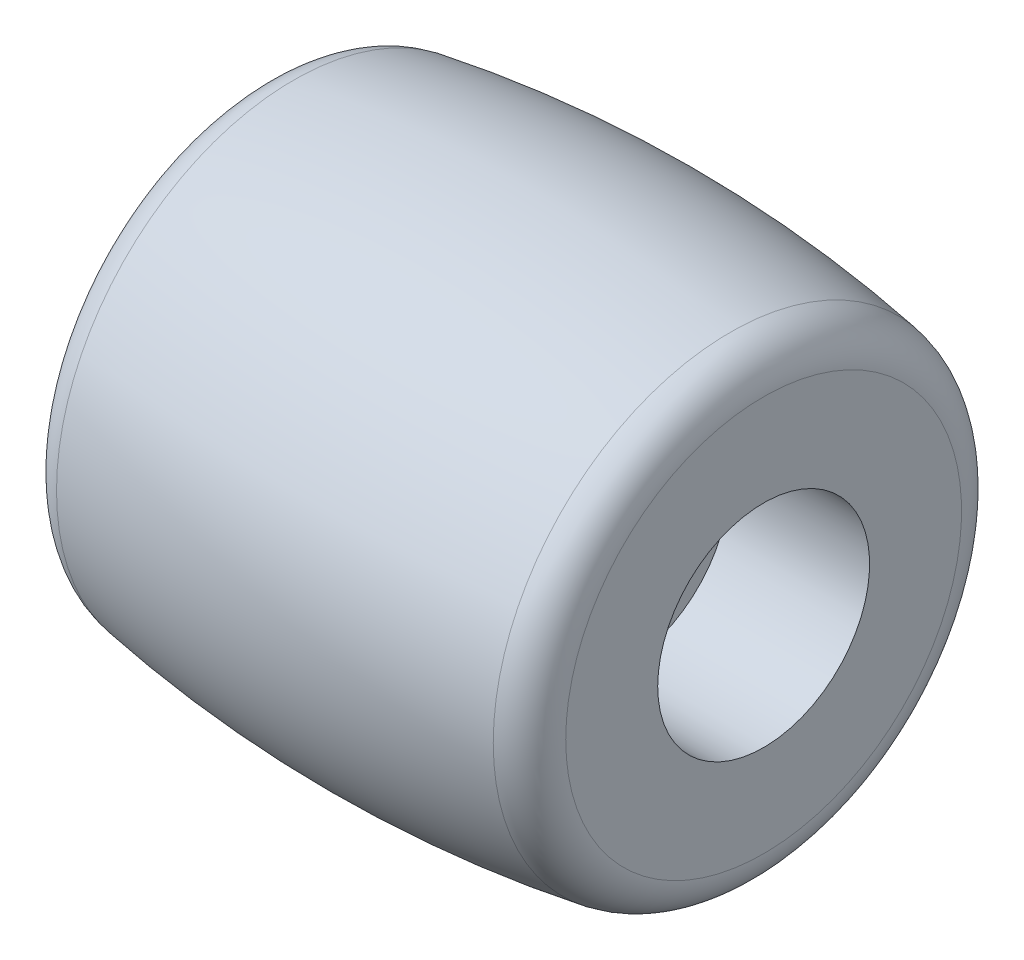
ISO-10303-21;
HEADER;
FILE_DESCRIPTION(('STEP AP214'),'2;1');
FILE_NAME('part.step','',(''),(''),'','','');
FILE_SCHEMA(('AUTOMOTIVE_DESIGN { 1 0 10303 214 1 1 1 1 }'));
ENDSEC;
DATA;
#1=APPLICATION_CONTEXT('core data for automotive mechanical design processes');
#2=APPLICATION_PROTOCOL_DEFINITION('international standard','automotive_design',2000,#1);
#3=PRODUCT_CONTEXT('',#1,'mechanical');
#4=PRODUCT('Part','Part','',(#3));
#5=PRODUCT_RELATED_PRODUCT_CATEGORY('part','',(#4));
#6=PRODUCT_DEFINITION_FORMATION('','',#4);
#7=PRODUCT_DEFINITION_CONTEXT('part definition',#1,'design');
#8=PRODUCT_DEFINITION('design','',#6,#7);
#9=PRODUCT_DEFINITION_SHAPE('','',#8);
#10=(LENGTH_UNIT() NAMED_UNIT(*) SI_UNIT(.MILLI.,.METRE.));
#11=(NAMED_UNIT(*) PLANE_ANGLE_UNIT() SI_UNIT($,.RADIAN.));
#12=(NAMED_UNIT(*) SI_UNIT($,.STERADIAN.) SOLID_ANGLE_UNIT());
#13=UNCERTAINTY_MEASURE_WITH_UNIT(LENGTH_MEASURE(1.E-05),#10,'distance_accuracy_value','');
#14=(GEOMETRIC_REPRESENTATION_CONTEXT(3) GLOBAL_UNCERTAINTY_ASSIGNED_CONTEXT((#13)) GLOBAL_UNIT_ASSIGNED_CONTEXT((#10,
#11,#12)) REPRESENTATION_CONTEXT('',''));
#15=CARTESIAN_POINT('',(0.,0.,0.));
#16=DIRECTION('',(0.,0.,1.));
#17=DIRECTION('',(1.,0.,0.));
#18=AXIS2_PLACEMENT_3D('',#15,#16,#17);
#19=CARTESIAN_POINT('',(-9.5,4.,0.));
#20=DIRECTION('',(1.,0.,0.));
#21=DIRECTION('',(0.,0.,-1.));
#22=AXIS2_PLACEMENT_3D('',#19,#20,#21);
#23=PLANE('',#22);
#24=CARTESIAN_POINT('',(-9.5,0.,0.));
#25=DIRECTION('',(1.,0.,0.));
#26=DIRECTION('',(0.,0.,-1.));
#27=AXIS2_PLACEMENT_3D('',#24,#25,#26);
#28=CIRCLE('',#27,7.47158261378696);
#29=CARTESIAN_POINT('',(-9.5,0.,-7.47158261378696));
#30=VERTEX_POINT('',#29);
#31=EDGE_CURVE('E10',#30,#30,#28,.F.);
#32=ORIENTED_EDGE('',*,*,#31,.T.);
#33=EDGE_LOOP('',(#32));
#34=FACE_BOUND('',#33,.T.);
#35=CARTESIAN_POINT('',(-9.5,0.,0.));
#36=DIRECTION('',(-1.,0.,0.));
#37=DIRECTION('',(0.,0.,1.));
#38=AXIS2_PLACEMENT_3D('',#35,#36,#37);
#39=CIRCLE('',#38,4.);
#40=CARTESIAN_POINT('',(-9.5,0.,4.));
#41=VERTEX_POINT('',#40);
#42=EDGE_CURVE('E65',#41,#41,#39,.T.);
#43=ORIENTED_EDGE('',*,*,#42,.F.);
#44=EDGE_LOOP('',(#43));
#45=FACE_BOUND('',#44,.T.);
#46=ADVANCED_FACE('F30',(#34,#45),#23,.F.);
#47=CARTESIAN_POINT('',(0.,0.,0.));
#48=DIRECTION('',(-1.,0.,0.));
#49=DIRECTION('',(0.,0.,1.));
#50=AXIS2_PLACEMENT_3D('',#47,#48,#49);
#51=DEGENERATE_TOROIDAL_SURFACE('',#50,41.175,50.8,.F.);
#52=CARTESIAN_POINT('',(8.24340770791075,0.,0.));
#53=DIRECTION('',(-1.,0.,0.));
#54=DIRECTION('',(0.,0.,1.));
#55=AXIS2_PLACEMENT_3D('',#52,#53,#54);
#56=CIRCLE('',#55,8.95170176025107);
#57=CARTESIAN_POINT('',(8.24340770791075,0.,8.95170176025107));
#58=VERTEX_POINT('',#57);
#59=EDGE_CURVE('E41',#58,#58,#56,.T.);
#60=ORIENTED_EDGE('',*,*,#59,.T.);
#61=EDGE_LOOP('',(#60));
#62=FACE_BOUND('',#61,.T.);
#63=CARTESIAN_POINT('',(-8.24340770791075,0.,0.));
#64=DIRECTION('',(1.,0.,0.));
#65=DIRECTION('',(0.,0.,-1.));
#66=AXIS2_PLACEMENT_3D('',#63,#64,#65);
#67=CIRCLE('',#66,8.95170176025107);
#68=CARTESIAN_POINT('',(-8.24340770791075,0.,-8.95170176025107));
#69=VERTEX_POINT('',#68);
#70=EDGE_CURVE('E45',#69,#69,#67,.T.);
#71=ORIENTED_EDGE('',*,*,#70,.T.);
#72=EDGE_LOOP('',(#71));
#73=FACE_BOUND('',#72,.T.);
#74=ADVANCED_FACE('F72',(#62,#73),#51,.F.);
#75=CARTESIAN_POINT('',(9.5,4.,0.));
#76=DIRECTION('',(-1.,0.,0.));
#77=DIRECTION('',(0.,0.,1.));
#78=AXIS2_PLACEMENT_3D('',#75,#76,#77);
#79=PLANE('',#78);
#80=CARTESIAN_POINT('',(9.5,0.,0.));
#81=DIRECTION('',(-1.,0.,0.));
#82=DIRECTION('',(0.,0.,1.));
#83=AXIS2_PLACEMENT_3D('',#80,#81,#82);
#84=CIRCLE('',#83,7.47158261378696);
#85=CARTESIAN_POINT('',(9.5,0.,7.47158261378696));
#86=VERTEX_POINT('',#85);
#87=EDGE_CURVE('E37',#86,#86,#84,.F.);
#88=ORIENTED_EDGE('',*,*,#87,.T.);
#89=EDGE_LOOP('',(#88));
#90=FACE_BOUND('',#89,.T.);
#91=CARTESIAN_POINT('',(9.5,0.,0.));
#92=DIRECTION('',(-1.,0.,0.));
#93=DIRECTION('',(0.,0.,1.));
#94=AXIS2_PLACEMENT_3D('',#91,#92,#93);
#95=CIRCLE('',#94,4.);
#96=CARTESIAN_POINT('',(9.5,0.,4.));
#97=VERTEX_POINT('',#96);
#98=EDGE_CURVE('E50',#97,#97,#95,.T.);
#99=ORIENTED_EDGE('',*,*,#98,.T.);
#100=EDGE_LOOP('',(#99));
#101=FACE_BOUND('',#100,.T.);
#102=ADVANCED_FACE('F77',(#90,#101),#79,.F.);
#103=CARTESIAN_POINT('',(0.,0.,0.));
#104=DIRECTION('',(-1.,0.,0.));
#105=DIRECTION('',(0.,0.,1.));
#106=AXIS2_PLACEMENT_3D('',#103,#104,#105);
#107=CYLINDRICAL_SURFACE('',#106,4.);
#108=ORIENTED_EDGE('',*,*,#98,.F.);
#109=EDGE_LOOP('',(#108));
#110=FACE_BOUND('',#109,.T.);
#111=CARTESIAN_POINT('',(4.2,0.,0.));
#112=DIRECTION('',(-1.,0.,0.));
#113=DIRECTION('',(0.,0.,1.));
#114=AXIS2_PLACEMENT_3D('',#111,#112,#113);
#115=CIRCLE('',#114,4.);
#116=CARTESIAN_POINT('',(4.2,0.,4.));
#117=VERTEX_POINT('',#116);
#118=EDGE_CURVE('E53',#117,#117,#115,.T.);
#119=ORIENTED_EDGE('',*,*,#118,.T.);
#120=EDGE_LOOP('',(#119));
#121=FACE_BOUND('',#120,.T.);
#122=ADVANCED_FACE('F111',(#110,#121),#107,.F.);
#123=CARTESIAN_POINT('',(4.2,2.5,0.));
#124=DIRECTION('',(-1.,0.,0.));
#125=DIRECTION('',(0.,0.,1.));
#126=AXIS2_PLACEMENT_3D('',#123,#124,#125);
#127=PLANE('',#126);
#128=ORIENTED_EDGE('',*,*,#118,.F.);
#129=EDGE_LOOP('',(#128));
#130=FACE_BOUND('',#129,.T.);
#131=CARTESIAN_POINT('',(4.2,0.,0.));
#132=DIRECTION('',(-1.,0.,0.));
#133=DIRECTION('',(0.,0.,1.));
#134=AXIS2_PLACEMENT_3D('',#131,#132,#133);
#135=CIRCLE('',#134,2.5);
#136=CARTESIAN_POINT('',(4.2,0.,2.5));
#137=VERTEX_POINT('',#136);
#138=EDGE_CURVE('E56',#137,#137,#135,.T.);
#139=ORIENTED_EDGE('',*,*,#138,.T.);
#140=EDGE_LOOP('',(#139));
#141=FACE_BOUND('',#140,.T.);
#142=ADVANCED_FACE('F107',(#130,#141),#127,.F.);
#143=CARTESIAN_POINT('',(0.,0.,0.));
#144=DIRECTION('',(-1.,0.,0.));
#145=DIRECTION('',(0.,0.,1.));
#146=AXIS2_PLACEMENT_3D('',#143,#144,#145);
#147=CYLINDRICAL_SURFACE('',#146,2.5);
#148=ORIENTED_EDGE('',*,*,#138,.F.);
#149=EDGE_LOOP('',(#148));
#150=FACE_BOUND('',#149,.T.);
#151=CARTESIAN_POINT('',(-4.2,0.,0.));
#152=DIRECTION('',(-1.,0.,0.));
#153=DIRECTION('',(0.,0.,1.));
#154=AXIS2_PLACEMENT_3D('',#151,#152,#153);
#155=CIRCLE('',#154,2.5);
#156=CARTESIAN_POINT('',(-4.2,0.,2.5));
#157=VERTEX_POINT('',#156);
#158=EDGE_CURVE('E59',#157,#157,#155,.T.);
#159=ORIENTED_EDGE('',*,*,#158,.T.);
#160=EDGE_LOOP('',(#159));
#161=FACE_BOUND('',#160,.T.);
#162=ADVANCED_FACE('F100',(#150,#161),#147,.F.);
#163=CARTESIAN_POINT('',(-4.2,2.5,0.));
#164=DIRECTION('',(1.,0.,0.));
#165=DIRECTION('',(0.,0.,-1.));
#166=AXIS2_PLACEMENT_3D('',#163,#164,#165);
#167=PLANE('',#166);
#168=ORIENTED_EDGE('',*,*,#158,.F.);
#169=EDGE_LOOP('',(#168));
#170=FACE_BOUND('',#169,.T.);
#171=CARTESIAN_POINT('',(-4.2,0.,0.));
#172=DIRECTION('',(-1.,0.,0.));
#173=DIRECTION('',(0.,0.,1.));
#174=AXIS2_PLACEMENT_3D('',#171,#172,#173);
#175=CIRCLE('',#174,4.);
#176=CARTESIAN_POINT('',(-4.2,0.,4.));
#177=VERTEX_POINT('',#176);
#178=EDGE_CURVE('E62',#177,#177,#175,.T.);
#179=ORIENTED_EDGE('',*,*,#178,.T.);
#180=EDGE_LOOP('',(#179));
#181=FACE_BOUND('',#180,.T.);
#182=ADVANCED_FACE('F89',(#170,#181),#167,.F.);
#183=CARTESIAN_POINT('',(0.,0.,0.));
#184=DIRECTION('',(-1.,0.,0.));
#185=DIRECTION('',(0.,0.,1.));
#186=AXIS2_PLACEMENT_3D('',#183,#184,#185);
#187=CYLINDRICAL_SURFACE('',#186,4.);
#188=ORIENTED_EDGE('',*,*,#178,.F.);
#189=EDGE_LOOP('',(#188));
#190=FACE_BOUND('',#189,.T.);
#191=ORIENTED_EDGE('',*,*,#42,.T.);
#192=EDGE_LOOP('',(#191));
#193=FACE_BOUND('',#192,.T.);
#194=ADVANCED_FACE('F69',(#190,#193),#187,.F.);
#195=CARTESIAN_POINT('',(8.,0.,0.));
#196=DIRECTION('',(-1.,0.,0.));
#197=DIRECTION('',(0.,0.,1.));
#198=AXIS2_PLACEMENT_3D('',#195,#196,#197);
#199=TOROIDAL_SURFACE('',#198,7.47158261378696,1.5);
#200=ORIENTED_EDGE('',*,*,#87,.F.);
#201=EDGE_LOOP('',(#200));
#202=FACE_BOUND('',#201,.T.);
#203=ORIENTED_EDGE('',*,*,#59,.F.);
#204=EDGE_LOOP('',(#203));
#205=FACE_BOUND('',#204,.T.);
#206=ADVANCED_FACE('F81',(#202,#205),#199,.T.);
#207=CARTESIAN_POINT('',(-8.,0.,0.));
#208=DIRECTION('',(1.,0.,0.));
#209=DIRECTION('',(0.,0.,-1.));
#210=AXIS2_PLACEMENT_3D('',#207,#208,#209);
#211=TOROIDAL_SURFACE('',#210,7.47158261378696,1.5);
#212=ORIENTED_EDGE('',*,*,#70,.F.);
#213=EDGE_LOOP('',(#212));
#214=FACE_BOUND('',#213,.T.);
#215=ORIENTED_EDGE('',*,*,#31,.F.);
#216=EDGE_LOOP('',(#215));
#217=FACE_BOUND('',#216,.T.);
#218=ADVANCED_FACE('F32',(#214,#217),#211,.T.);
#219=CLOSED_SHELL('',(#46,#74,#102,#122,#142,#162,#182,#194,#206,#218));
#220=MANIFOLD_SOLID_BREP('B2',#219);
#221=ADVANCED_BREP_SHAPE_REPRESENTATION('',(#18,#220),#14);
#222=SHAPE_DEFINITION_REPRESENTATION(#9,#221);
ENDSEC;
END-ISO-10303-21;
